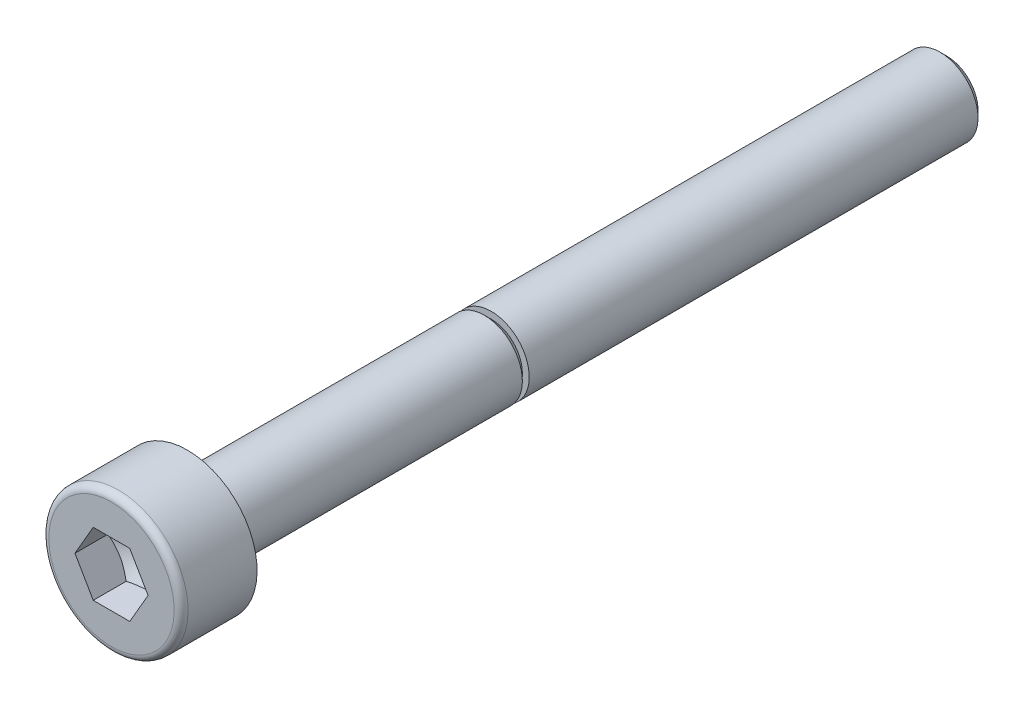
ISO-10303-21;
HEADER;
FILE_DESCRIPTION(('STEP AP214'),'2;1');
FILE_NAME('part.step','',(''),(''),'','','');
FILE_SCHEMA(('AUTOMOTIVE_DESIGN { 1 0 10303 214 1 1 1 1 }'));
ENDSEC;
DATA;
#1=APPLICATION_CONTEXT('core data for automotive mechanical design processes');
#2=APPLICATION_PROTOCOL_DEFINITION('international standard','automotive_design',2000,#1);
#3=PRODUCT_CONTEXT('',#1,'mechanical');
#4=PRODUCT('Part','Part','',(#3));
#5=PRODUCT_RELATED_PRODUCT_CATEGORY('part','',(#4));
#6=PRODUCT_DEFINITION_FORMATION('','',#4);
#7=PRODUCT_DEFINITION_CONTEXT('part definition',#1,'design');
#8=PRODUCT_DEFINITION('design','',#6,#7);
#9=PRODUCT_DEFINITION_SHAPE('','',#8);
#10=(LENGTH_UNIT() NAMED_UNIT(*) SI_UNIT(.MILLI.,.METRE.));
#11=(NAMED_UNIT(*) PLANE_ANGLE_UNIT() SI_UNIT($,.RADIAN.));
#12=(NAMED_UNIT(*) SI_UNIT($,.STERADIAN.) SOLID_ANGLE_UNIT());
#13=UNCERTAINTY_MEASURE_WITH_UNIT(LENGTH_MEASURE(1.E-05),#10,'distance_accuracy_value','');
#14=(GEOMETRIC_REPRESENTATION_CONTEXT(3) GLOBAL_UNCERTAINTY_ASSIGNED_CONTEXT((#13)) GLOBAL_UNIT_ASSIGNED_CONTEXT((#10,
#11,#12)) REPRESENTATION_CONTEXT('',''));
#15=CARTESIAN_POINT('',(0.,0.,0.));
#16=DIRECTION('',(0.,0.,1.));
#17=DIRECTION('',(1.,0.,0.));
#18=AXIS2_PLACEMENT_3D('',#15,#16,#17);
#19=CARTESIAN_POINT('',(0.,1.2375,3.));
#20=DIRECTION('',(0.,0.,1.));
#21=DIRECTION('',(0.,-1.,0.));
#22=AXIS2_PLACEMENT_3D('',#19,#20,#21);
#23=PLANE('',#22);
#24=CARTESIAN_POINT('',(0.,0.,3.));
#25=DIRECTION('',(0.,0.,-1.));
#26=DIRECTION('',(0.,1.,0.));
#27=AXIS2_PLACEMENT_3D('',#24,#25,#26);
#28=CIRCLE('',#27,2.475);
#29=CARTESIAN_POINT('',(0.,2.475,3.));
#30=VERTEX_POINT('',#29);
#31=EDGE_CURVE('E183',#30,#30,#28,.T.);
#32=ORIENTED_EDGE('',*,*,#31,.F.);
#33=EDGE_LOOP('',(#32));
#34=FACE_BOUND('',#33,.T.);
#35=DIRECTION('',(-0.5,0.866025403784439,0.));
#36=VECTOR('',#35,1.);
#37=CARTESIAN_POINT('',(-1.35045785929581,-0.160937208593682,3.));
#38=LINE('',#37,#36);
#39=CARTESIAN_POINT('',(-0.7216875,-1.24999941718736,3.));
#40=VERTEX_POINT('',#39);
#41=CARTESIAN_POINT('',(-1.443375,0.,3.));
#42=VERTEX_POINT('',#41);
#43=EDGE_CURVE('E98',#40,#42,#38,.T.);
#44=ORIENTED_EDGE('',*,*,#43,.T.);
#45=DIRECTION('',(0.5,0.866025403784439,0.));
#46=VECTOR('',#45,1.);
#47=CARTESIAN_POINT('',(-0.81460464070419,1.08906220859368,3.));
#48=LINE('',#47,#46);
#49=CARTESIAN_POINT('',(-0.7216875,1.24999941718736,3.));
#50=VERTEX_POINT('',#49);
#51=EDGE_CURVE('E179',#42,#50,#48,.T.);
#52=ORIENTED_EDGE('',*,*,#51,.T.);
#53=DIRECTION('',(1.,0.,0.));
#54=VECTOR('',#53,1.);
#55=CARTESIAN_POINT('',(0.,1.24999941718736,3.));
#56=LINE('',#55,#54);
#57=CARTESIAN_POINT('',(0.7216875,1.24999941718736,3.));
#58=VERTEX_POINT('',#57);
#59=EDGE_CURVE('E168',#50,#58,#56,.T.);
#60=ORIENTED_EDGE('',*,*,#59,.T.);
#61=DIRECTION('',(0.5,-0.866025403784439,0.));
#62=VECTOR('',#61,1.);
#63=CARTESIAN_POINT('',(0.814604640704189,1.08906220859368,3.));
#64=LINE('',#63,#62);
#65=CARTESIAN_POINT('',(1.443375,0.,3.));
#66=VERTEX_POINT('',#65);
#67=EDGE_CURVE('E175',#58,#66,#64,.T.);
#68=ORIENTED_EDGE('',*,*,#67,.T.);
#69=DIRECTION('',(-0.5,-0.866025403784439,0.));
#70=VECTOR('',#69,1.);
#71=CARTESIAN_POINT('',(1.35045785929581,-0.160937208593682,3.));
#72=LINE('',#71,#70);
#73=CARTESIAN_POINT('',(0.7216875,-1.24999941718736,3.));
#74=VERTEX_POINT('',#73);
#75=EDGE_CURVE('E101',#66,#74,#72,.T.);
#76=ORIENTED_EDGE('',*,*,#75,.T.);
#77=DIRECTION('',(-1.,0.,0.));
#78=VECTOR('',#77,1.);
#79=CARTESIAN_POINT('',(0.,-1.24999941718736,3.));
#80=LINE('',#79,#78);
#81=EDGE_CURVE('E95',#74,#40,#80,.T.);
#82=ORIENTED_EDGE('',*,*,#81,.T.);
#83=EDGE_LOOP('',(#44,#52,#60,#68,#76,#82));
#84=FACE_BOUND('',#83,.T.);
#85=ADVANCED_FACE('F15',(#34,#84),#23,.T.);
#86=CARTESIAN_POINT('',(0.,0.6146875,-30.));
#87=DIRECTION('',(0.,0.,-1.));
#88=DIRECTION('',(0.,1.,0.));
#89=AXIS2_PLACEMENT_3D('',#86,#87,#88);
#90=PLANE('',#89);
#91=CARTESIAN_POINT('',(0.,0.,-30.));
#92=DIRECTION('',(0.,0.,-1.));
#93=DIRECTION('',(0.,1.,0.));
#94=AXIS2_PLACEMENT_3D('',#91,#92,#93);
#95=CIRCLE('',#94,1.229375);
#96=CARTESIAN_POINT('',(0.,1.229375,-30.));
#97=VERTEX_POINT('',#96);
#98=EDGE_CURVE('E10',#97,#97,#95,.T.);
#99=ORIENTED_EDGE('',*,*,#98,.T.);
#100=EDGE_LOOP('',(#99));
#101=FACE_BOUND('',#100,.T.);
#102=ADVANCED_FACE('F215',(#101),#90,.T.);
#103=CARTESIAN_POINT('',(0.,0.,-29.8646875));
#104=DIRECTION('',(0.,0.,1.));
#105=DIRECTION('',(0.,1.,0.));
#106=AXIS2_PLACEMENT_3D('',#103,#104,#105);
#107=CONICAL_SURFACE('',#106,1.3646875,0.785398163397443);
#108=CARTESIAN_POINT('',(0.,0.,-29.729375));
#109=DIRECTION('',(0.,0.,-1.));
#110=DIRECTION('',(0.,1.,0.));
#111=AXIS2_PLACEMENT_3D('',#108,#109,#110);
#112=CIRCLE('',#111,1.5);
#113=CARTESIAN_POINT('',(0.,1.5,-29.729375));
#114=VERTEX_POINT('',#113);
#115=EDGE_CURVE('E22',#114,#114,#112,.T.);
#116=ORIENTED_EDGE('',*,*,#115,.T.);
#117=EDGE_LOOP('',(#116));
#118=FACE_BOUND('',#117,.T.);
#119=ORIENTED_EDGE('',*,*,#98,.F.);
#120=EDGE_LOOP('',(#119));
#121=FACE_BOUND('',#120,.T.);
#122=ADVANCED_FACE('F212',(#118,#121),#107,.T.);
#123=CARTESIAN_POINT('',(0.,0.,-20.8646875));
#124=DIRECTION('',(0.,0.,1.));
#125=DIRECTION('',(0.,1.,0.));
#126=AXIS2_PLACEMENT_3D('',#123,#124,#125);
#127=CYLINDRICAL_SURFACE('',#126,1.5);
#128=CARTESIAN_POINT('',(0.,0.,-12.));
#129=DIRECTION('',(0.,0.,-1.));
#130=DIRECTION('',(0.,1.,0.));
#131=AXIS2_PLACEMENT_3D('',#128,#129,#130);
#132=CIRCLE('',#131,1.5);
#133=CARTESIAN_POINT('',(0.,1.5,-12.));
#134=VERTEX_POINT('',#133);
#135=EDGE_CURVE('E193',#134,#134,#132,.T.);
#136=ORIENTED_EDGE('',*,*,#135,.T.);
#137=EDGE_LOOP('',(#136));
#138=FACE_BOUND('',#137,.T.);
#139=ORIENTED_EDGE('',*,*,#115,.F.);
#140=EDGE_LOOP('',(#139));
#141=FACE_BOUND('',#140,.T.);
#142=ADVANCED_FACE('F196',(#138,#141),#127,.T.);
#143=CARTESIAN_POINT('',(0.,1.3646875,-12.));
#144=DIRECTION('',(0.,0.,1.));
#145=DIRECTION('',(0.,-1.,0.));
#146=AXIS2_PLACEMENT_3D('',#143,#144,#145);
#147=PLANE('',#146);
#148=CARTESIAN_POINT('',(0.,0.,-12.));
#149=DIRECTION('',(0.,0.,-1.));
#150=DIRECTION('',(0.,1.,0.));
#151=AXIS2_PLACEMENT_3D('',#148,#149,#150);
#152=CIRCLE('',#151,1.229375);
#153=CARTESIAN_POINT('',(0.,1.229375,-12.));
#154=VERTEX_POINT('',#153);
#155=EDGE_CURVE('E191',#154,#154,#152,.T.);
#156=ORIENTED_EDGE('',*,*,#155,.T.);
#157=EDGE_LOOP('',(#156));
#158=FACE_BOUND('',#157,.T.);
#159=ORIENTED_EDGE('',*,*,#135,.F.);
#160=EDGE_LOOP('',(#159));
#161=FACE_BOUND('',#160,.T.);
#162=ADVANCED_FACE('F199',(#158,#161),#147,.T.);
#163=CARTESIAN_POINT('',(0.,0.,-11.8646875));
#164=DIRECTION('',(0.,0.,1.));
#165=DIRECTION('',(0.,1.,0.));
#166=AXIS2_PLACEMENT_3D('',#163,#164,#165);
#167=CONICAL_SURFACE('',#166,1.3646875,0.785398163397447);
#168=CARTESIAN_POINT('',(0.,0.,-11.729375));
#169=DIRECTION('',(0.,0.,-1.));
#170=DIRECTION('',(0.,1.,0.));
#171=AXIS2_PLACEMENT_3D('',#168,#169,#170);
#172=CIRCLE('',#171,1.5);
#173=CARTESIAN_POINT('',(0.,1.5,-11.729375));
#174=VERTEX_POINT('',#173);
#175=EDGE_CURVE('E189',#174,#174,#172,.T.);
#176=ORIENTED_EDGE('',*,*,#175,.T.);
#177=EDGE_LOOP('',(#176));
#178=FACE_BOUND('',#177,.T.);
#179=ORIENTED_EDGE('',*,*,#155,.F.);
#180=EDGE_LOOP('',(#179));
#181=FACE_BOUND('',#180,.T.);
#182=ADVANCED_FACE('F201',(#178,#181),#167,.T.);
#183=CARTESIAN_POINT('',(0.,0.,-5.9396875));
#184=DIRECTION('',(0.,0.,1.));
#185=DIRECTION('',(0.,1.,0.));
#186=AXIS2_PLACEMENT_3D('',#183,#184,#185);
#187=CYLINDRICAL_SURFACE('',#186,1.5);
#188=CARTESIAN_POINT('',(0.,0.,-0.15));
#189=DIRECTION('',(0.,0.,-1.));
#190=DIRECTION('',(0.,1.,0.));
#191=AXIS2_PLACEMENT_3D('',#188,#189,#190);
#192=CIRCLE('',#191,1.5);
#193=CARTESIAN_POINT('',(0.,1.5,-0.15));
#194=VERTEX_POINT('',#193);
#195=EDGE_CURVE('E122',#194,#194,#192,.T.);
#196=ORIENTED_EDGE('',*,*,#195,.T.);
#197=EDGE_LOOP('',(#196));
#198=FACE_BOUND('',#197,.T.);
#199=ORIENTED_EDGE('',*,*,#175,.F.);
#200=EDGE_LOOP('',(#199));
#201=FACE_BOUND('',#200,.T.);
#202=ADVANCED_FACE('F209',(#198,#201),#187,.T.);
#203=CARTESIAN_POINT('',(0.,0.,-0.15));
#204=DIRECTION('',(0.,0.,-1.));
#205=DIRECTION('',(-1.,0.,0.));
#206=AXIS2_PLACEMENT_3D('',#203,#204,#205);
#207=TOROIDAL_SURFACE('',#206,1.65,0.15);
#208=CARTESIAN_POINT('',(0.,0.,0.));
#209=DIRECTION('',(0.,0.,-1.));
#210=DIRECTION('',(0.,1.,0.));
#211=AXIS2_PLACEMENT_3D('',#208,#209,#210);
#212=CIRCLE('',#211,1.65);
#213=CARTESIAN_POINT('',(0.,1.65,0.));
#214=VERTEX_POINT('',#213);
#215=EDGE_CURVE('E187',#214,#214,#212,.T.);
#216=ORIENTED_EDGE('',*,*,#215,.T.);
#217=EDGE_LOOP('',(#216));
#218=FACE_BOUND('',#217,.T.);
#219=ORIENTED_EDGE('',*,*,#195,.F.);
#220=EDGE_LOOP('',(#219));
#221=FACE_BOUND('',#220,.T.);
#222=ADVANCED_FACE('F239',(#218,#221),#207,.F.);
#223=CARTESIAN_POINT('',(0.,2.2,0.));
#224=DIRECTION('',(0.,0.,-1.));
#225=DIRECTION('',(0.,1.,0.));
#226=AXIS2_PLACEMENT_3D('',#223,#224,#225);
#227=PLANE('',#226);
#228=CARTESIAN_POINT('',(0.,0.,0.));
#229=DIRECTION('',(0.,0.,-1.));
#230=DIRECTION('',(0.,1.,0.));
#231=AXIS2_PLACEMENT_3D('',#228,#229,#230);
#232=CIRCLE('',#231,2.75);
#233=CARTESIAN_POINT('',(0.,2.75,0.));
#234=VERTEX_POINT('',#233);
#235=EDGE_CURVE('E185',#234,#234,#232,.T.);
#236=ORIENTED_EDGE('',*,*,#235,.T.);
#237=EDGE_LOOP('',(#236));
#238=FACE_BOUND('',#237,.T.);
#239=ORIENTED_EDGE('',*,*,#215,.F.);
#240=EDGE_LOOP('',(#239));
#241=FACE_BOUND('',#240,.T.);
#242=ADVANCED_FACE('F233',(#238,#241),#227,.T.);
#243=CARTESIAN_POINT('',(0.,0.,1.3625));
#244=DIRECTION('',(0.,0.,1.));
#245=DIRECTION('',(0.,1.,0.));
#246=AXIS2_PLACEMENT_3D('',#243,#244,#245);
#247=CYLINDRICAL_SURFACE('',#246,2.75);
#248=CARTESIAN_POINT('',(0.,0.,2.725));
#249=DIRECTION('',(0.,0.,-1.));
#250=DIRECTION('',(0.,1.,0.));
#251=AXIS2_PLACEMENT_3D('',#248,#249,#250);
#252=CIRCLE('',#251,2.75);
#253=CARTESIAN_POINT('',(0.,2.75,2.725));
#254=VERTEX_POINT('',#253);
#255=EDGE_CURVE('E181',#254,#254,#252,.T.);
#256=ORIENTED_EDGE('',*,*,#255,.T.);
#257=EDGE_LOOP('',(#256));
#258=FACE_BOUND('',#257,.T.);
#259=ORIENTED_EDGE('',*,*,#235,.F.);
#260=EDGE_LOOP('',(#259));
#261=FACE_BOUND('',#260,.T.);
#262=ADVANCED_FACE('F227',(#258,#261),#247,.T.);
#263=CARTESIAN_POINT('',(0.,0.,2.725));
#264=DIRECTION('',(0.,0.,-1.));
#265=DIRECTION('',(-1.,0.,0.));
#266=AXIS2_PLACEMENT_3D('',#263,#264,#265);
#267=TOROIDAL_SURFACE('',#266,2.475,0.275);
#268=ORIENTED_EDGE('',*,*,#31,.T.);
#269=EDGE_LOOP('',(#268));
#270=FACE_BOUND('',#269,.T.);
#271=ORIENTED_EDGE('',*,*,#255,.F.);
#272=EDGE_LOOP('',(#271));
#273=FACE_BOUND('',#272,.T.);
#274=ADVANCED_FACE('F223',(#270,#273),#267,.T.);
#275=CARTESIAN_POINT('',(-1.08253125,0.624999708593682,3.));
#276=DIRECTION('',(-0.866025403784439,0.5,0.));
#277=DIRECTION('',(0.5,0.866025403784439,0.));
#278=AXIS2_PLACEMENT_3D('',#275,#276,#277);
#279=PLANE('',#278);
#280=CARTESIAN_POINT('',(-1.443375,0.,1.7));
#281=CARTESIAN_POINT('',(-1.08253125,0.62499970859368,1.49166676380211));
#282=CARTESIAN_POINT('',(-0.7216875,1.24999941718736,1.7));
#283=(BOUNDED_CURVE() B_SPLINE_CURVE(2,(#280,#281,#282),.UNSPECIFIED.,.F.,
.F.) B_SPLINE_CURVE_WITH_KNOTS((3,3),(0.,1.46054449161806),
.UNSPECIFIED.) CURVE() GEOMETRIC_REPRESENTATION_ITEM() RATIONAL_B_SPLINE_CURVE((1.,
1.15470053837926,1.)) REPRESENTATION_ITEM(''));
#284=CARTESIAN_POINT('',(-1.443375,0.,1.7));
#285=VERTEX_POINT('',#284);
#286=CARTESIAN_POINT('',(-0.7216875,1.24999941718736,1.7));
#287=VERTEX_POINT('',#286);
#288=EDGE_CURVE('E142',#285,#287,#283,.T.);
#289=ORIENTED_EDGE('',*,*,#288,.T.);
#290=DIRECTION('',(0.,0.,-1.));
#291=VECTOR('',#290,1.);
#292=CARTESIAN_POINT('',(-0.7216875,1.24999941718736,3.));
#293=LINE('',#292,#291);
#294=EDGE_CURVE('E169',#50,#287,#293,.T.);
#295=ORIENTED_EDGE('',*,*,#294,.F.);
#296=ORIENTED_EDGE('',*,*,#51,.F.);
#297=DIRECTION('',(0.,0.,-1.));
#298=VECTOR('',#297,1.);
#299=CARTESIAN_POINT('',(-1.443375,0.,3.));
#300=LINE('',#299,#298);
#301=EDGE_CURVE('E116',#42,#285,#300,.T.);
#302=ORIENTED_EDGE('',*,*,#301,.T.);
#303=EDGE_LOOP('',(#289,#295,#296,#302));
#304=FACE_BOUND('',#303,.T.);
#305=ADVANCED_FACE('F226',(#304),#279,.F.);
#306=CARTESIAN_POINT('',(0.,1.24999941718736,3.));
#307=DIRECTION('',(0.,1.,0.));
#308=DIRECTION('',(1.,0.,0.));
#309=AXIS2_PLACEMENT_3D('',#306,#307,#308);
#310=PLANE('',#309);
#311=CARTESIAN_POINT('',(-0.7216875,1.24999941718736,1.7));
#312=CARTESIAN_POINT('',(0.,1.24999941718737,1.4916667638021));
#313=CARTESIAN_POINT('',(0.7216875,1.24999941718736,1.7));
#314=(BOUNDED_CURVE() B_SPLINE_CURVE(2,(#311,#312,#313),.UNSPECIFIED.,.F.,
.F.) B_SPLINE_CURVE_WITH_KNOTS((3,3),(0.,1.46054449161806),
.UNSPECIFIED.) CURVE() GEOMETRIC_REPRESENTATION_ITEM() RATIONAL_B_SPLINE_CURVE((1.,
1.15470053837925,1.)) REPRESENTATION_ITEM(''));
#315=CARTESIAN_POINT('',(0.7216875,1.24999941718736,1.7));
#316=VERTEX_POINT('',#315);
#317=EDGE_CURVE('E128',#287,#316,#314,.T.);
#318=ORIENTED_EDGE('',*,*,#317,.T.);
#319=DIRECTION('',(0.,0.,-1.));
#320=VECTOR('',#319,1.);
#321=CARTESIAN_POINT('',(0.7216875,1.24999941718736,3.));
#322=LINE('',#321,#320);
#323=EDGE_CURVE('E170',#58,#316,#322,.T.);
#324=ORIENTED_EDGE('',*,*,#323,.F.);
#325=ORIENTED_EDGE('',*,*,#59,.F.);
#326=ORIENTED_EDGE('',*,*,#294,.T.);
#327=EDGE_LOOP('',(#318,#324,#325,#326));
#328=FACE_BOUND('',#327,.T.);
#329=ADVANCED_FACE('F257',(#328),#310,.F.);
#330=CARTESIAN_POINT('',(1.08253125,0.624999708593682,3.));
#331=DIRECTION('',(0.866025403784439,0.5,0.));
#332=DIRECTION('',(0.5,-0.866025403784439,0.));
#333=AXIS2_PLACEMENT_3D('',#330,#331,#332);
#334=PLANE('',#333);
#335=CARTESIAN_POINT('',(0.7216875,1.24999941718737,1.7));
#336=CARTESIAN_POINT('',(1.08253125,0.624999708593683,1.49166676380211));
#337=CARTESIAN_POINT('',(1.443375,0.,1.7));
#338=(BOUNDED_CURVE() B_SPLINE_CURVE(2,(#335,#336,#337),.UNSPECIFIED.,.F.,
.F.) B_SPLINE_CURVE_WITH_KNOTS((3,3),(0.,1.46054449161806),
.UNSPECIFIED.) CURVE() GEOMETRIC_REPRESENTATION_ITEM() RATIONAL_B_SPLINE_CURVE((1.,
1.15470053837925,1.)) REPRESENTATION_ITEM(''));
#339=CARTESIAN_POINT('',(1.443375,0.,1.7));
#340=VERTEX_POINT('',#339);
#341=EDGE_CURVE('E123',#316,#340,#338,.T.);
#342=ORIENTED_EDGE('',*,*,#341,.T.);
#343=DIRECTION('',(0.,0.,-1.));
#344=VECTOR('',#343,1.);
#345=CARTESIAN_POINT('',(1.443375,0.,3.));
#346=LINE('',#345,#344);
#347=EDGE_CURVE('E173',#66,#340,#346,.T.);
#348=ORIENTED_EDGE('',*,*,#347,.F.);
#349=ORIENTED_EDGE('',*,*,#67,.F.);
#350=ORIENTED_EDGE('',*,*,#323,.T.);
#351=EDGE_LOOP('',(#342,#348,#349,#350));
#352=FACE_BOUND('',#351,.T.);
#353=ADVANCED_FACE('F259',(#352),#334,.F.);
#354=CARTESIAN_POINT('',(1.08253125,-0.624999708593682,3.));
#355=DIRECTION('',(0.866025403784439,-0.5,0.));
#356=DIRECTION('',(-0.5,-0.866025403784439,0.));
#357=AXIS2_PLACEMENT_3D('',#354,#355,#356);
#358=PLANE('',#357);
#359=CARTESIAN_POINT('',(1.443375,0.,1.7));
#360=CARTESIAN_POINT('',(1.08253125,-0.624999708593683,1.49166676380211));
#361=CARTESIAN_POINT('',(0.7216875,-1.24999941718737,1.7));
#362=(BOUNDED_CURVE() B_SPLINE_CURVE(2,(#359,#360,#361),.UNSPECIFIED.,.F.,
.F.) B_SPLINE_CURVE_WITH_KNOTS((3,3),(0.,1.46054449161806),
.UNSPECIFIED.) CURVE() GEOMETRIC_REPRESENTATION_ITEM() RATIONAL_B_SPLINE_CURVE((1.,
1.15470053837925,1.)) REPRESENTATION_ITEM(''));
#363=CARTESIAN_POINT('',(0.7216875,-1.24999941718736,1.7));
#364=VERTEX_POINT('',#363);
#365=EDGE_CURVE('E118',#340,#364,#362,.T.);
#366=ORIENTED_EDGE('',*,*,#365,.T.);
#367=DIRECTION('',(0.,0.,-1.));
#368=VECTOR('',#367,1.);
#369=CARTESIAN_POINT('',(0.7216875,-1.24999941718736,3.));
#370=LINE('',#369,#368);
#371=EDGE_CURVE('E104',#74,#364,#370,.T.);
#372=ORIENTED_EDGE('',*,*,#371,.F.);
#373=ORIENTED_EDGE('',*,*,#75,.F.);
#374=ORIENTED_EDGE('',*,*,#347,.T.);
#375=EDGE_LOOP('',(#366,#372,#373,#374));
#376=FACE_BOUND('',#375,.T.);
#377=ADVANCED_FACE('F264',(#376),#358,.F.);
#378=CARTESIAN_POINT('',(0.,-1.24999941718736,3.));
#379=DIRECTION('',(0.,-1.,0.));
#380=DIRECTION('',(-1.,0.,0.));
#381=AXIS2_PLACEMENT_3D('',#378,#379,#380);
#382=PLANE('',#381);
#383=CARTESIAN_POINT('',(0.7216875,-1.24999941718736,1.7));
#384=CARTESIAN_POINT('',(0.,-1.24999941718736,1.4916667638021));
#385=CARTESIAN_POINT('',(-0.7216875,-1.24999941718736,1.7));
#386=(BOUNDED_CURVE() B_SPLINE_CURVE(2,(#383,#384,#385),.UNSPECIFIED.,.F.,
.F.) B_SPLINE_CURVE_WITH_KNOTS((3,3),(0.,1.46054449161806),
.UNSPECIFIED.) CURVE() GEOMETRIC_REPRESENTATION_ITEM() RATIONAL_B_SPLINE_CURVE((1.,
1.15470053837925,1.)) REPRESENTATION_ITEM(''));
#387=CARTESIAN_POINT('',(-0.7216875,-1.24999941718736,1.7));
#388=VERTEX_POINT('',#387);
#389=EDGE_CURVE('E110',#364,#388,#386,.T.);
#390=ORIENTED_EDGE('',*,*,#389,.T.);
#391=DIRECTION('',(0.,0.,-1.));
#392=VECTOR('',#391,1.);
#393=CARTESIAN_POINT('',(-0.7216875,-1.24999941718736,3.));
#394=LINE('',#393,#392);
#395=EDGE_CURVE('E105',#40,#388,#394,.T.);
#396=ORIENTED_EDGE('',*,*,#395,.F.);
#397=ORIENTED_EDGE('',*,*,#81,.F.);
#398=ORIENTED_EDGE('',*,*,#371,.T.);
#399=EDGE_LOOP('',(#390,#396,#397,#398));
#400=FACE_BOUND('',#399,.T.);
#401=ADVANCED_FACE('F108',(#400),#382,.F.);
#402=CARTESIAN_POINT('',(-1.08253125,-0.624999708593682,3.));
#403=DIRECTION('',(-0.866025403784439,-0.5,0.));
#404=DIRECTION('',(-0.5,0.866025403784439,0.));
#405=AXIS2_PLACEMENT_3D('',#402,#403,#404);
#406=PLANE('',#405);
#407=CARTESIAN_POINT('',(-0.7216875,-1.24999941718737,1.7));
#408=CARTESIAN_POINT('',(-1.08253125,-0.624999708593682,1.4916667638021));
#409=CARTESIAN_POINT('',(-1.443375,0.,1.7));
#410=(BOUNDED_CURVE() B_SPLINE_CURVE(2,(#407,#408,#409),.UNSPECIFIED.,.F.,
.F.) B_SPLINE_CURVE_WITH_KNOTS((3,3),(0.,1.46054449161806),
.UNSPECIFIED.) CURVE() GEOMETRIC_REPRESENTATION_ITEM() RATIONAL_B_SPLINE_CURVE((1.,
1.15470053837925,1.)) REPRESENTATION_ITEM(''));
#411=EDGE_CURVE('E151',#388,#285,#410,.T.);
#412=ORIENTED_EDGE('',*,*,#411,.T.);
#413=ORIENTED_EDGE('',*,*,#301,.F.);
#414=ORIENTED_EDGE('',*,*,#43,.F.);
#415=ORIENTED_EDGE('',*,*,#395,.T.);
#416=EDGE_LOOP('',(#412,#413,#414,#415));
#417=FACE_BOUND('',#416,.T.);
#418=ADVANCED_FACE('F115',(#417),#406,.F.);
#419=CARTESIAN_POINT('',(0.,0.,1.28333352760421));
#420=DIRECTION('',(0.,0.,1.));
#421=DIRECTION('',(0.,1.,0.));
#422=AXIS2_PLACEMENT_3D('',#419,#420,#421);
#423=CONICAL_SURFACE('',#422,0.7216875,1.0471975511966);
#424=CARTESIAN_POINT('',(0.,0.,0.866667055208424));
#425=VERTEX_POINT('',#424);
#426=VERTEX_LOOP('',#425);
#427=FACE_BOUND('',#426,.T.);
#428=ORIENTED_EDGE('',*,*,#341,.F.);
#429=ORIENTED_EDGE('',*,*,#317,.F.);
#430=ORIENTED_EDGE('',*,*,#288,.F.);
#431=ORIENTED_EDGE('',*,*,#411,.F.);
#432=ORIENTED_EDGE('',*,*,#389,.F.);
#433=ORIENTED_EDGE('',*,*,#365,.F.);
#434=EDGE_LOOP('',(#428,#429,#430,#431,#432,#433));
#435=FACE_BOUND('',#434,.T.);
#436=ADVANCED_FACE('F273',(#427,#435),#423,.F.);
#437=CLOSED_SHELL('',(#85,#102,#122,#142,#162,#182,#202,#222,#242,#262,#274,#305,#329,#353,#377,
#401,#418,#436));
#438=MANIFOLD_SOLID_BREP('B1',#437);
#439=ADVANCED_BREP_SHAPE_REPRESENTATION('',(#18,#438),#14);
#440=SHAPE_DEFINITION_REPRESENTATION(#9,#439);
ENDSEC;
END-ISO-10303-21;
